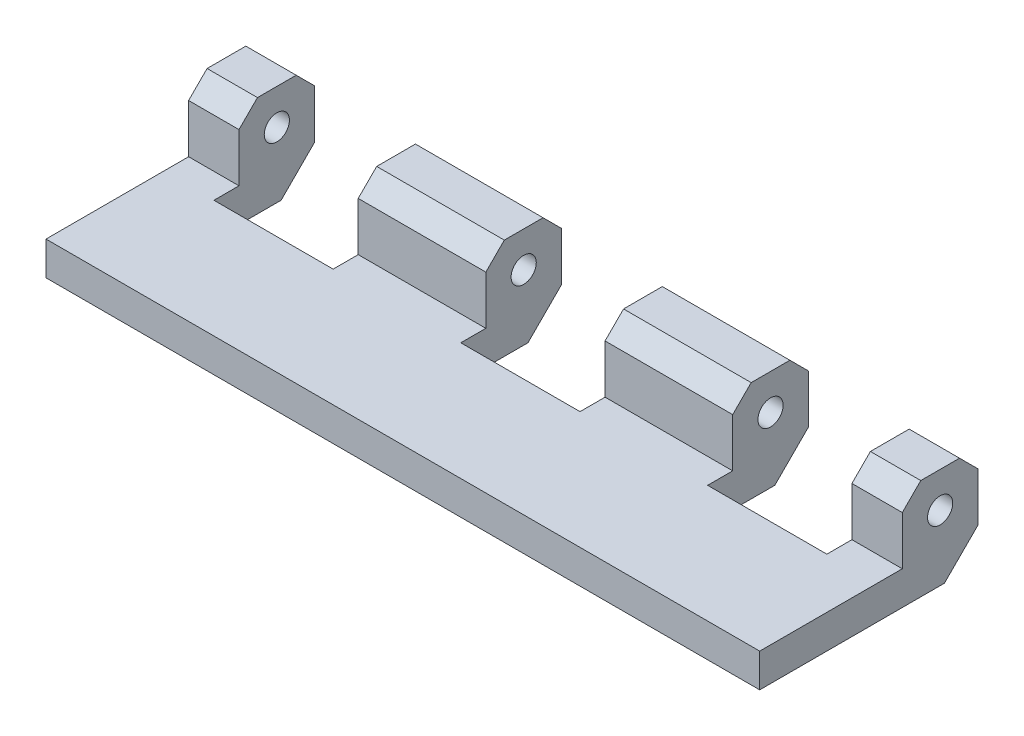
ISO-10303-21;
HEADER;
FILE_DESCRIPTION(('STEP AP214'),'2;1');
FILE_NAME('part.step','',(''),(''),'','','');
FILE_SCHEMA(('AUTOMOTIVE_DESIGN { 1 0 10303 214 1 1 1 1 }'));
ENDSEC;
DATA;
#1=APPLICATION_CONTEXT('core data for automotive mechanical design processes');
#2=APPLICATION_PROTOCOL_DEFINITION('international standard','automotive_design',2000,#1);
#3=PRODUCT_CONTEXT('',#1,'mechanical');
#4=PRODUCT('Part','Part','',(#3));
#5=PRODUCT_RELATED_PRODUCT_CATEGORY('part','',(#4));
#6=PRODUCT_DEFINITION_FORMATION('','',#4);
#7=PRODUCT_DEFINITION_CONTEXT('part definition',#1,'design');
#8=PRODUCT_DEFINITION('design','',#6,#7);
#9=PRODUCT_DEFINITION_SHAPE('','',#8);
#10=(LENGTH_UNIT() NAMED_UNIT(*) SI_UNIT(.MILLI.,.METRE.));
#11=(NAMED_UNIT(*) PLANE_ANGLE_UNIT() SI_UNIT($,.RADIAN.));
#12=(NAMED_UNIT(*) SI_UNIT($,.STERADIAN.) SOLID_ANGLE_UNIT());
#13=UNCERTAINTY_MEASURE_WITH_UNIT(LENGTH_MEASURE(1.E-05),#10,'distance_accuracy_value','');
#14=(GEOMETRIC_REPRESENTATION_CONTEXT(3) GLOBAL_UNCERTAINTY_ASSIGNED_CONTEXT((#13)) GLOBAL_UNIT_ASSIGNED_CONTEXT((#10,
#11,#12)) REPRESENTATION_CONTEXT('',''));
#15=CARTESIAN_POINT('',(0.,0.,0.));
#16=DIRECTION('',(0.,0.,1.));
#17=DIRECTION('',(1.,0.,0.));
#18=AXIS2_PLACEMENT_3D('',#15,#16,#17);
#19=CARTESIAN_POINT('',(-9.00000000000001,12.,0.));
#20=DIRECTION('',(0.,0.,1.));
#21=DIRECTION('',(1.,0.,0.));
#22=AXIS2_PLACEMENT_3D('',#19,#20,#21);
#23=PLANE('',#22);
#24=DIRECTION('',(-1.,0.,0.));
#25=VECTOR('',#24,1.);
#26=CARTESIAN_POINT('',(-9.00000000000001,4.,0.));
#27=LINE('',#26,#25);
#28=CARTESIAN_POINT('',(55.8,3.9999999999998,2.06016328849326E-13));
#29=VERTEX_POINT('',#28);
#30=CARTESIAN_POINT('',(40.6,4.,0.));
#31=VERTEX_POINT('',#30);
#32=EDGE_CURVE('E511',#29,#31,#27,.T.);
#33=ORIENTED_EDGE('',*,*,#32,.T.);
#34=DIRECTION('',(0.,1.,0.));
#35=VECTOR('',#34,1.);
#36=CARTESIAN_POINT('',(40.6,0.,0.));
#37=LINE('',#36,#35);
#38=CARTESIAN_POINT('',(40.6,9.79999999999999,0.));
#39=VERTEX_POINT('',#38);
#40=EDGE_CURVE('E284',#31,#39,#37,.T.);
#41=ORIENTED_EDGE('',*,*,#40,.T.);
#42=DIRECTION('',(1.,0.,0.));
#43=VECTOR('',#42,1.);
#44=CARTESIAN_POINT('',(76.,9.79999999999999,0.));
#45=LINE('',#44,#43);
#46=CARTESIAN_POINT('',(55.8,9.8000000000002,2.06016328849326E-13));
#47=VERTEX_POINT('',#46);
#48=EDGE_CURVE('E496',#39,#47,#45,.T.);
#49=ORIENTED_EDGE('',*,*,#48,.T.);
#50=DIRECTION('',(0.,1.,0.));
#51=VECTOR('',#50,1.);
#52=CARTESIAN_POINT('',(55.8,0.,2.06016328849326E-13));
#53=LINE('',#52,#51);
#54=EDGE_CURVE('E346',#29,#47,#53,.T.);
#55=ORIENTED_EDGE('',*,*,#54,.F.);
#56=EDGE_LOOP('',(#33,#41,#49,#55));
#57=FACE_BOUND('',#56,.T.);
#58=ADVANCED_FACE('F31',(#57),#23,.F.);
#59=CARTESIAN_POINT('',(-9.00000000000001,12.,26.));
#60=DIRECTION('',(0.,1.,0.));
#61=DIRECTION('',(0.,0.,1.));
#62=AXIS2_PLACEMENT_3D('',#59,#60,#61);
#63=PLANE('',#62);
#64=DIRECTION('',(0.,0.,-1.));
#65=VECTOR('',#64,1.);
#66=CARTESIAN_POINT('',(40.6,12.,12.0000000000004));
#67=LINE('',#66,#65);
#68=CARTESIAN_POINT('',(40.6,12.,6.81626105451301));
#69=VERTEX_POINT('',#68);
#70=CARTESIAN_POINT('',(40.6,12.,2.19999999999999));
#71=VERTEX_POINT('',#70);
#72=EDGE_CURVE('E296',#69,#71,#67,.T.);
#73=ORIENTED_EDGE('',*,*,#72,.F.);
#74=DIRECTION('',(1.,0.,0.));
#75=VECTOR('',#74,1.);
#76=CARTESIAN_POINT('',(76.,12.,6.816261054513));
#77=LINE('',#76,#75);
#78=CARTESIAN_POINT('',(55.8,12.,6.816261054513));
#79=VERTEX_POINT('',#78);
#80=EDGE_CURVE('E480',#69,#79,#77,.T.);
#81=ORIENTED_EDGE('',*,*,#80,.T.);
#82=DIRECTION('',(0.,0.,1.));
#83=VECTOR('',#82,1.);
#84=CARTESIAN_POINT('',(55.8,12.,12.0000000000002));
#85=LINE('',#84,#83);
#86=CARTESIAN_POINT('',(55.8,12.,2.19999999999999));
#87=VERTEX_POINT('',#86);
#88=EDGE_CURVE('E329',#87,#79,#85,.T.);
#89=ORIENTED_EDGE('',*,*,#88,.F.);
#90=DIRECTION('',(-1.,0.,0.));
#91=VECTOR('',#90,1.);
#92=CARTESIAN_POINT('',(-9.00000000000001,12.,2.19999999999999));
#93=LINE('',#92,#91);
#94=EDGE_CURVE('E485',#87,#71,#93,.T.);
#95=ORIENTED_EDGE('',*,*,#94,.T.);
#96=EDGE_LOOP('',(#73,#81,#89,#95));
#97=FACE_BOUND('',#96,.T.);
#98=ADVANCED_FACE('F684',(#97),#63,.T.);
#99=CARTESIAN_POINT('',(-9.00000000000001,13.0176696078048,9.01626105451301));
#100=DIRECTION('',(0.,0.,-1.));
#101=DIRECTION('',(0.,1.,0.));
#102=AXIS2_PLACEMENT_3D('',#99,#100,#101);
#103=PLANE('',#102);
#104=DIRECTION('',(-1.,0.,0.));
#105=VECTOR('',#104,1.);
#106=CARTESIAN_POINT('',(-9.00000000000001,9.80000000000001,9.01626105451301));
#107=LINE('',#106,#105);
#108=CARTESIAN_POINT('',(55.8,9.80000000000001,9.016261054513));
#109=VERTEX_POINT('',#108);
#110=CARTESIAN_POINT('',(40.6,9.80000000000001,9.016261054513));
#111=VERTEX_POINT('',#110);
#112=EDGE_CURVE('E505',#109,#111,#107,.T.);
#113=ORIENTED_EDGE('',*,*,#112,.T.);
#114=DIRECTION('',(0.,-1.,0.));
#115=VECTOR('',#114,1.);
#116=CARTESIAN_POINT('',(40.6,13.0176696078048,9.016261054513));
#117=LINE('',#116,#115);
#118=CARTESIAN_POINT('',(40.6,4.,9.01626105451299));
#119=VERTEX_POINT('',#118);
#120=EDGE_CURVE('E313',#111,#119,#117,.T.);
#121=ORIENTED_EDGE('',*,*,#120,.T.);
#122=DIRECTION('',(1.,0.,0.));
#123=VECTOR('',#122,1.);
#124=CARTESIAN_POINT('',(-9.00000000000001,4.,9.016261054513));
#125=LINE('',#124,#123);
#126=CARTESIAN_POINT('',(55.8,4.,9.01626105451299));
#127=VERTEX_POINT('',#126);
#128=EDGE_CURVE('E54',#119,#127,#125,.T.);
#129=ORIENTED_EDGE('',*,*,#128,.T.);
#130=DIRECTION('',(0.,1.,0.));
#131=VECTOR('',#130,1.);
#132=CARTESIAN_POINT('',(55.8,13.0176696078048,9.016261054513));
#133=LINE('',#132,#131);
#134=EDGE_CURVE('E342',#127,#109,#133,.T.);
#135=ORIENTED_EDGE('',*,*,#134,.T.);
#136=EDGE_LOOP('',(#113,#121,#129,#135));
#137=FACE_BOUND('',#136,.T.);
#138=ADVANCED_FACE('F689',(#137),#103,.F.);
#139=CARTESIAN_POINT('',(-9.00000000000001,12.,2.19999999999999));
#140=DIRECTION('',(0.,0.707106781186545,-0.70710678118655));
#141=DIRECTION('',(0.,0.70710678118655,0.707106781186545));
#142=AXIS2_PLACEMENT_3D('',#139,#140,#141);
#143=PLANE('',#142);
#144=DIRECTION('',(0.,-0.70710678118655,-0.707106781186545));
#145=VECTOR('',#144,1.);
#146=CARTESIAN_POINT('',(40.6,12.,2.19999999999999));
#147=LINE('',#146,#145);
#148=EDGE_CURVE('E322',#71,#39,#147,.T.);
#149=ORIENTED_EDGE('',*,*,#148,.F.);
#150=ORIENTED_EDGE('',*,*,#94,.F.);
#151=DIRECTION('',(0.,0.70710678118655,0.707106781186545));
#152=VECTOR('',#151,1.);
#153=CARTESIAN_POINT('',(55.8,12.,2.19999999999999));
#154=LINE('',#153,#152);
#155=EDGE_CURVE('E359',#47,#87,#154,.T.);
#156=ORIENTED_EDGE('',*,*,#155,.F.);
#157=ORIENTED_EDGE('',*,*,#48,.F.);
#158=EDGE_LOOP('',(#149,#150,#156,#157));
#159=FACE_BOUND('',#158,.T.);
#160=ADVANCED_FACE('F653',(#159),#143,.T.);
#161=CARTESIAN_POINT('',(-9.00000000000001,9.80000000000001,9.01626105451301));
#162=DIRECTION('',(0.,0.707106781186547,0.707106781186547));
#163=DIRECTION('',(0.,-0.707106781186548,0.707106781186548));
#164=AXIS2_PLACEMENT_3D('',#161,#162,#163);
#165=PLANE('',#164);
#166=DIRECTION('',(0.,0.707106781186548,-0.707106781186548));
#167=VECTOR('',#166,1.);
#168=CARTESIAN_POINT('',(40.6,9.8,9.016261054513));
#169=LINE('',#168,#167);
#170=EDGE_CURVE('E315',#111,#69,#169,.T.);
#171=ORIENTED_EDGE('',*,*,#170,.F.);
#172=ORIENTED_EDGE('',*,*,#112,.F.);
#173=DIRECTION('',(0.,-0.707106781186548,0.707106781186548));
#174=VECTOR('',#173,1.);
#175=CARTESIAN_POINT('',(55.8,9.8,9.016261054513));
#176=LINE('',#175,#174);
#177=EDGE_CURVE('E352',#79,#109,#176,.T.);
#178=ORIENTED_EDGE('',*,*,#177,.F.);
#179=ORIENTED_EDGE('',*,*,#80,.F.);
#180=EDGE_LOOP('',(#171,#172,#178,#179));
#181=FACE_BOUND('',#180,.T.);
#182=ADVANCED_FACE('F724',(#181),#165,.T.);
#183=CARTESIAN_POINT('',(-9.00000000000001,4.,0.));
#184=DIRECTION('',(0.,0.707106781186549,0.707106781186546));
#185=DIRECTION('',(0.,-0.707106781186546,0.707106781186549));
#186=AXIS2_PLACEMENT_3D('',#183,#184,#185);
#187=PLANE('',#186);
#188=DIRECTION('',(0.,0.707106781186546,-0.707106781186549));
#189=VECTOR('',#188,1.);
#190=CARTESIAN_POINT('',(40.6,4.,0.));
#191=LINE('',#190,#189);
#192=CARTESIAN_POINT('',(40.6,0.,4.00000000000002));
#193=VERTEX_POINT('',#192);
#194=EDGE_CURVE('E320',#31,#193,#191,.F.);
#195=ORIENTED_EDGE('',*,*,#194,.F.);
#196=ORIENTED_EDGE('',*,*,#32,.F.);
#197=DIRECTION('',(0.,-0.707106781186546,0.707106781186549));
#198=VECTOR('',#197,1.);
#199=CARTESIAN_POINT('',(55.8,4.,0.));
#200=LINE('',#199,#198);
#201=CARTESIAN_POINT('',(55.8,0.,4.00000000000002));
#202=VERTEX_POINT('',#201);
#203=EDGE_CURVE('E357',#202,#29,#200,.F.);
#204=ORIENTED_EDGE('',*,*,#203,.F.);
#205=DIRECTION('',(1.,0.,0.));
#206=VECTOR('',#205,1.);
#207=CARTESIAN_POINT('',(-9.00000000000001,0.,4.00000000000002));
#208=LINE('',#207,#206);
#209=EDGE_CURVE('E519',#193,#202,#208,.T.);
#210=ORIENTED_EDGE('',*,*,#209,.F.);
#211=EDGE_LOOP('',(#195,#196,#204,#210));
#212=FACE_BOUND('',#211,.T.);
#213=ADVANCED_FACE('F549',(#212),#187,.F.);
#214=CARTESIAN_POINT('',(-9.00000000000001,7.77705431232267,4.50813052725649));
#215=DIRECTION('',(1.,0.,0.));
#216=DIRECTION('',(0.,0.,-1.));
#217=AXIS2_PLACEMENT_3D('',#214,#215,#216);
#218=CYLINDRICAL_SURFACE('',#217,1.5);
#219=CARTESIAN_POINT('',(40.6,7.77705431232267,4.50813052725649));
#220=DIRECTION('',(1.,0.,0.));
#221=DIRECTION('',(0.,0.,-1.));
#222=AXIS2_PLACEMENT_3D('',#219,#220,#221);
#223=CIRCLE('',#222,1.5);
#224=CARTESIAN_POINT('',(40.6,7.77705431232267,3.00813052725649));
#225=VERTEX_POINT('',#224);
#226=EDGE_CURVE('E317',#225,#225,#223,.F.);
#227=ORIENTED_EDGE('',*,*,#226,.T.);
#228=EDGE_LOOP('',(#227));
#229=FACE_BOUND('',#228,.T.);
#230=CARTESIAN_POINT('',(55.8,7.77705431232267,4.50813052725649));
#231=DIRECTION('',(-1.,0.,0.));
#232=DIRECTION('',(0.,0.,1.));
#233=AXIS2_PLACEMENT_3D('',#230,#231,#232);
#234=CIRCLE('',#233,1.5);
#235=CARTESIAN_POINT('',(55.8,7.77705431232267,6.00813052725649));
#236=VERTEX_POINT('',#235);
#237=EDGE_CURVE('E354',#236,#236,#234,.F.);
#238=ORIENTED_EDGE('',*,*,#237,.T.);
#239=EDGE_LOOP('',(#238));
#240=FACE_BOUND('',#239,.T.);
#241=ADVANCED_FACE('F694',(#229,#240),#218,.F.);
#242=CARTESIAN_POINT('',(76.,4.00000000000001,0.));
#243=VERTEX_POINT('',#242);
#244=CARTESIAN_POINT('',(70.,3.9999999999998,2.06016328849326E-13));
#245=VERTEX_POINT('',#244);
#246=EDGE_CURVE('E507',#243,#245,#27,.T.);
#247=ORIENTED_EDGE('',*,*,#246,.T.);
#248=DIRECTION('',(0.,1.,0.));
#249=VECTOR('',#248,1.);
#250=CARTESIAN_POINT('',(70.,0.,2.06016328849326E-13));
#251=LINE('',#250,#249);
#252=CARTESIAN_POINT('',(70.,9.8000000000002,2.06016328849326E-13));
#253=VERTEX_POINT('',#252);
#254=EDGE_CURVE('E335',#245,#253,#251,.T.);
#255=ORIENTED_EDGE('',*,*,#254,.T.);
#256=CARTESIAN_POINT('',(76.,9.79999999999999,0.));
#257=VERTEX_POINT('',#256);
#258=EDGE_CURVE('E490',#253,#257,#45,.T.);
#259=ORIENTED_EDGE('',*,*,#258,.T.);
#260=DIRECTION('',(0.,-1.,0.));
#261=VECTOR('',#260,1.);
#262=CARTESIAN_POINT('',(76.,12.,0.));
#263=LINE('',#262,#261);
#264=EDGE_CURVE('E466',#257,#243,#263,.T.);
#265=ORIENTED_EDGE('',*,*,#264,.T.);
#266=EDGE_LOOP('',(#247,#255,#259,#265));
#267=FACE_BOUND('',#266,.T.);
#268=ADVANCED_FACE('F567',(#267),#23,.F.);
#269=DIRECTION('',(0.,0.,-1.));
#270=VECTOR('',#269,1.);
#271=CARTESIAN_POINT('',(70.,12.,12.0000000000002));
#272=LINE('',#271,#270);
#273=CARTESIAN_POINT('',(70.,12.,6.816261054513));
#274=VERTEX_POINT('',#273);
#275=CARTESIAN_POINT('',(70.,12.,2.19999999999999));
#276=VERTEX_POINT('',#275);
#277=EDGE_CURVE('E324',#274,#276,#272,.T.);
#278=ORIENTED_EDGE('',*,*,#277,.F.);
#279=CARTESIAN_POINT('',(76.,12.,6.816261054513));
#280=VERTEX_POINT('',#279);
#281=EDGE_CURVE('E474',#274,#280,#77,.T.);
#282=ORIENTED_EDGE('',*,*,#281,.T.);
#283=DIRECTION('',(0.,0.,-1.));
#284=VECTOR('',#283,1.);
#285=CARTESIAN_POINT('',(76.,12.,0.));
#286=LINE('',#285,#284);
#287=CARTESIAN_POINT('',(76.,12.,2.19999999999999));
#288=VERTEX_POINT('',#287);
#289=EDGE_CURVE('E453',#280,#288,#286,.T.);
#290=ORIENTED_EDGE('',*,*,#289,.T.);
#291=EDGE_CURVE('E481',#288,#276,#93,.T.);
#292=ORIENTED_EDGE('',*,*,#291,.T.);
#293=EDGE_LOOP('',(#278,#282,#290,#292));
#294=FACE_BOUND('',#293,.T.);
#295=ADVANCED_FACE('F577',(#294),#63,.T.);
#296=CARTESIAN_POINT('',(76.,9.80000000000001,9.01626105451299));
#297=VERTEX_POINT('',#296);
#298=CARTESIAN_POINT('',(70.,9.80000000000001,9.01626105451299));
#299=VERTEX_POINT('',#298);
#300=EDGE_CURVE('E501',#297,#299,#107,.T.);
#301=ORIENTED_EDGE('',*,*,#300,.T.);
#302=DIRECTION('',(0.,-1.,0.));
#303=VECTOR('',#302,1.);
#304=CARTESIAN_POINT('',(70.,13.0176696078048,9.01626105451299));
#305=LINE('',#304,#303);
#306=CARTESIAN_POINT('',(70.,4.,9.01626105451299));
#307=VERTEX_POINT('',#306);
#308=EDGE_CURVE('E361',#299,#307,#305,.T.);
#309=ORIENTED_EDGE('',*,*,#308,.T.);
#310=CARTESIAN_POINT('',(76.,4.,9.01626105451299));
#311=VERTEX_POINT('',#310);
#312=EDGE_CURVE('E437',#307,#311,#125,.T.);
#313=ORIENTED_EDGE('',*,*,#312,.T.);
#314=DIRECTION('',(0.,1.,0.));
#315=VECTOR('',#314,1.);
#316=CARTESIAN_POINT('',(76.,13.0176696078048,9.01626105451299));
#317=LINE('',#316,#315);
#318=EDGE_CURVE('E434',#311,#297,#317,.T.);
#319=ORIENTED_EDGE('',*,*,#318,.T.);
#320=EDGE_LOOP('',(#301,#309,#313,#319));
#321=FACE_BOUND('',#320,.T.);
#322=ADVANCED_FACE('F586',(#321),#103,.F.);
#323=DIRECTION('',(0.,-0.70710678118655,-0.707106781186545));
#324=VECTOR('',#323,1.);
#325=CARTESIAN_POINT('',(70.,12.,2.19999999999999));
#326=LINE('',#325,#324);
#327=EDGE_CURVE('E371',#276,#253,#326,.T.);
#328=ORIENTED_EDGE('',*,*,#327,.F.);
#329=ORIENTED_EDGE('',*,*,#291,.F.);
#330=DIRECTION('',(0.,0.70710678118655,0.707106781186545));
#331=VECTOR('',#330,1.);
#332=CARTESIAN_POINT('',(76.,12.,2.19999999999999));
#333=LINE('',#332,#331);
#334=EDGE_CURVE('E498',#257,#288,#333,.T.);
#335=ORIENTED_EDGE('',*,*,#334,.F.);
#336=ORIENTED_EDGE('',*,*,#258,.F.);
#337=EDGE_LOOP('',(#328,#329,#335,#336));
#338=FACE_BOUND('',#337,.T.);
#339=ADVANCED_FACE('F574',(#338),#143,.T.);
#340=DIRECTION('',(0.,0.707106781186548,-0.707106781186548));
#341=VECTOR('',#340,1.);
#342=CARTESIAN_POINT('',(70.,9.8,9.016261054513));
#343=LINE('',#342,#341);
#344=EDGE_CURVE('E364',#299,#274,#343,.T.);
#345=ORIENTED_EDGE('',*,*,#344,.F.);
#346=ORIENTED_EDGE('',*,*,#300,.F.);
#347=DIRECTION('',(0.,-0.707106781186548,0.707106781186548));
#348=VECTOR('',#347,1.);
#349=CARTESIAN_POINT('',(76.,9.8,9.016261054513));
#350=LINE('',#349,#348);
#351=EDGE_CURVE('E494',#280,#297,#350,.T.);
#352=ORIENTED_EDGE('',*,*,#351,.F.);
#353=ORIENTED_EDGE('',*,*,#281,.F.);
#354=EDGE_LOOP('',(#345,#346,#352,#353));
#355=FACE_BOUND('',#354,.T.);
#356=ADVANCED_FACE('F584',(#355),#165,.T.);
#357=DIRECTION('',(0.,0.707106781186546,-0.707106781186549));
#358=VECTOR('',#357,1.);
#359=CARTESIAN_POINT('',(70.,4.,0.));
#360=LINE('',#359,#358);
#361=CARTESIAN_POINT('',(70.,0.,4.00000000000002));
#362=VERTEX_POINT('',#361);
#363=EDGE_CURVE('E369',#245,#362,#360,.F.);
#364=ORIENTED_EDGE('',*,*,#363,.F.);
#365=ORIENTED_EDGE('',*,*,#246,.F.);
#366=DIRECTION('',(0.,-0.707106781186546,0.707106781186549));
#367=VECTOR('',#366,1.);
#368=CARTESIAN_POINT('',(76.,4.,0.));
#369=LINE('',#368,#367);
#370=CARTESIAN_POINT('',(76.,0.,4.00000000000002));
#371=VERTEX_POINT('',#370);
#372=EDGE_CURVE('E518',#371,#243,#369,.F.);
#373=ORIENTED_EDGE('',*,*,#372,.F.);
#374=EDGE_CURVE('E514',#362,#371,#208,.T.);
#375=ORIENTED_EDGE('',*,*,#374,.F.);
#376=EDGE_LOOP('',(#364,#365,#373,#375));
#377=FACE_BOUND('',#376,.T.);
#378=ADVANCED_FACE('F565',(#377),#187,.F.);
#379=CARTESIAN_POINT('',(70.,7.77705431232267,4.50813052725649));
#380=DIRECTION('',(1.,0.,0.));
#381=DIRECTION('',(0.,0.,-1.));
#382=AXIS2_PLACEMENT_3D('',#379,#380,#381);
#383=CIRCLE('',#382,1.5);
#384=CARTESIAN_POINT('',(70.,7.77705431232267,3.00813052725649));
#385=VERTEX_POINT('',#384);
#386=EDGE_CURVE('E366',#385,#385,#383,.F.);
#387=ORIENTED_EDGE('',*,*,#386,.T.);
#388=EDGE_LOOP('',(#387));
#389=FACE_BOUND('',#388,.T.);
#390=CARTESIAN_POINT('',(76.,7.77705431232267,4.50813052725649));
#391=DIRECTION('',(1.,0.,0.));
#392=DIRECTION('',(0.,0.,-1.));
#393=AXIS2_PLACEMENT_3D('',#390,#391,#392);
#394=CIRCLE('',#393,1.5);
#395=CARTESIAN_POINT('',(76.,7.77705431232267,3.00813052725649));
#396=VERTEX_POINT('',#395);
#397=EDGE_CURVE('E423',#396,#396,#394,.T.);
#398=ORIENTED_EDGE('',*,*,#397,.T.);
#399=EDGE_LOOP('',(#398));
#400=FACE_BOUND('',#399,.T.);
#401=ADVANCED_FACE('F702',(#389,#400),#218,.F.);
#402=CARTESIAN_POINT('',(11.2,9.8000000000002,2.06016328849326E-13));
#403=VERTEX_POINT('',#402);
#404=CARTESIAN_POINT('',(26.4,9.79999999999999,0.));
#405=VERTEX_POINT('',#404);
#406=EDGE_CURVE('E495',#403,#405,#45,.T.);
#407=ORIENTED_EDGE('',*,*,#406,.T.);
#408=DIRECTION('',(0.,1.,0.));
#409=VECTOR('',#408,1.);
#410=CARTESIAN_POINT('',(26.4,0.,0.));
#411=LINE('',#410,#409);
#412=CARTESIAN_POINT('',(26.4,4.,0.));
#413=VERTEX_POINT('',#412);
#414=EDGE_CURVE('E275',#413,#405,#411,.T.);
#415=ORIENTED_EDGE('',*,*,#414,.F.);
#416=CARTESIAN_POINT('',(11.2,3.9999999999998,2.06016328849326E-13));
#417=VERTEX_POINT('',#416);
#418=EDGE_CURVE('E512',#413,#417,#27,.T.);
#419=ORIENTED_EDGE('',*,*,#418,.T.);
#420=DIRECTION('',(0.,1.,0.));
#421=VECTOR('',#420,1.);
#422=CARTESIAN_POINT('',(11.2,0.,2.06016328849326E-13));
#423=LINE('',#422,#421);
#424=EDGE_CURVE('E383',#417,#403,#423,.T.);
#425=ORIENTED_EDGE('',*,*,#424,.T.);
#426=EDGE_LOOP('',(#407,#415,#419,#425));
#427=FACE_BOUND('',#426,.T.);
#428=ADVANCED_FACE('F637',(#427),#23,.F.);
#429=DIRECTION('',(0.,0.,1.));
#430=VECTOR('',#429,1.);
#431=CARTESIAN_POINT('',(26.4,12.,12.0000000000004));
#432=LINE('',#431,#430);
#433=CARTESIAN_POINT('',(26.4,12.,2.19999999999999));
#434=VERTEX_POINT('',#433);
#435=CARTESIAN_POINT('',(26.4,12.,6.81626105451301));
#436=VERTEX_POINT('',#435);
#437=EDGE_CURVE('E293',#434,#436,#432,.T.);
#438=ORIENTED_EDGE('',*,*,#437,.F.);
#439=CARTESIAN_POINT('',(11.2,12.,2.19999999999999));
#440=VERTEX_POINT('',#439);
#441=EDGE_CURVE('E486',#434,#440,#93,.T.);
#442=ORIENTED_EDGE('',*,*,#441,.T.);
#443=DIRECTION('',(0.,0.,-1.));
#444=VECTOR('',#443,1.);
#445=CARTESIAN_POINT('',(11.2,12.,12.0000000000002));
#446=LINE('',#445,#444);
#447=CARTESIAN_POINT('',(11.2,12.,6.81626105451301));
#448=VERTEX_POINT('',#447);
#449=EDGE_CURVE('E373',#448,#440,#446,.T.);
#450=ORIENTED_EDGE('',*,*,#449,.F.);
#451=EDGE_CURVE('E479',#448,#436,#77,.T.);
#452=ORIENTED_EDGE('',*,*,#451,.T.);
#453=EDGE_LOOP('',(#438,#442,#450,#452));
#454=FACE_BOUND('',#453,.T.);
#455=ADVANCED_FACE('F661',(#454),#63,.T.);
#456=CARTESIAN_POINT('',(11.2,4.,9.016261054513));
#457=VERTEX_POINT('',#456);
#458=CARTESIAN_POINT('',(26.4,4.,9.016261054513));
#459=VERTEX_POINT('',#458);
#460=EDGE_CURVE('E446',#457,#459,#125,.T.);
#461=ORIENTED_EDGE('',*,*,#460,.T.);
#462=DIRECTION('',(0.,1.,0.));
#463=VECTOR('',#462,1.);
#464=CARTESIAN_POINT('',(26.4,13.0176696078048,9.016261054513));
#465=LINE('',#464,#463);
#466=CARTESIAN_POINT('',(26.4,9.80000000000001,9.016261054513));
#467=VERTEX_POINT('',#466);
#468=EDGE_CURVE('E46',#459,#467,#465,.T.);
#469=ORIENTED_EDGE('',*,*,#468,.T.);
#470=CARTESIAN_POINT('',(11.2,9.80000000000001,9.016261054513));
#471=VERTEX_POINT('',#470);
#472=EDGE_CURVE('E506',#467,#471,#107,.T.);
#473=ORIENTED_EDGE('',*,*,#472,.T.);
#474=DIRECTION('',(0.,-1.,0.));
#475=VECTOR('',#474,1.);
#476=CARTESIAN_POINT('',(11.2,13.0176696078048,9.016261054513));
#477=LINE('',#476,#475);
#478=EDGE_CURVE('E415',#471,#457,#477,.T.);
#479=ORIENTED_EDGE('',*,*,#478,.T.);
#480=EDGE_LOOP('',(#461,#469,#473,#479));
#481=FACE_BOUND('',#480,.T.);
#482=ADVANCED_FACE('F671',(#481),#103,.F.);
#483=DIRECTION('',(0.,0.70710678118655,0.707106781186545));
#484=VECTOR('',#483,1.);
#485=CARTESIAN_POINT('',(26.4,12.,2.19999999999999));
#486=LINE('',#485,#484);
#487=EDGE_CURVE('E311',#405,#434,#486,.T.);
#488=ORIENTED_EDGE('',*,*,#487,.F.);
#489=ORIENTED_EDGE('',*,*,#406,.F.);
#490=DIRECTION('',(0.,-0.70710678118655,-0.707106781186545));
#491=VECTOR('',#490,1.);
#492=CARTESIAN_POINT('',(11.2,12.,2.19999999999999));
#493=LINE('',#492,#491);
#494=EDGE_CURVE('E421',#440,#403,#493,.T.);
#495=ORIENTED_EDGE('',*,*,#494,.F.);
#496=ORIENTED_EDGE('',*,*,#441,.F.);
#497=EDGE_LOOP('',(#488,#489,#495,#496));
#498=FACE_BOUND('',#497,.T.);
#499=ADVANCED_FACE('F668',(#498),#143,.T.);
#500=DIRECTION('',(0.,-0.707106781186548,0.707106781186548));
#501=VECTOR('',#500,1.);
#502=CARTESIAN_POINT('',(26.4,9.8,9.016261054513));
#503=LINE('',#502,#501);
#504=EDGE_CURVE('E304',#436,#467,#503,.T.);
#505=ORIENTED_EDGE('',*,*,#504,.F.);
#506=ORIENTED_EDGE('',*,*,#451,.F.);
#507=DIRECTION('',(0.,0.707106781186548,-0.707106781186548));
#508=VECTOR('',#507,1.);
#509=CARTESIAN_POINT('',(11.2,9.8,9.016261054513));
#510=LINE('',#509,#508);
#511=EDGE_CURVE('E413',#471,#448,#510,.T.);
#512=ORIENTED_EDGE('',*,*,#511,.F.);
#513=ORIENTED_EDGE('',*,*,#472,.F.);
#514=EDGE_LOOP('',(#505,#506,#512,#513));
#515=FACE_BOUND('',#514,.T.);
#516=ADVANCED_FACE('F670',(#515),#165,.T.);
#517=DIRECTION('',(0.,-0.707106781186546,0.707106781186549));
#518=VECTOR('',#517,1.);
#519=CARTESIAN_POINT('',(26.4,4.,0.));
#520=LINE('',#519,#518);
#521=CARTESIAN_POINT('',(26.4,0.,4.00000000000002));
#522=VERTEX_POINT('',#521);
#523=EDGE_CURVE('E309',#522,#413,#520,.F.);
#524=ORIENTED_EDGE('',*,*,#523,.F.);
#525=CARTESIAN_POINT('',(11.2,0.,4.00000000000002));
#526=VERTEX_POINT('',#525);
#527=EDGE_CURVE('E290',#526,#522,#208,.T.);
#528=ORIENTED_EDGE('',*,*,#527,.F.);
#529=DIRECTION('',(0.,0.707106781186546,-0.707106781186549));
#530=VECTOR('',#529,1.);
#531=CARTESIAN_POINT('',(11.2,4.,0.));
#532=LINE('',#531,#530);
#533=EDGE_CURVE('E411',#417,#526,#532,.F.);
#534=ORIENTED_EDGE('',*,*,#533,.F.);
#535=ORIENTED_EDGE('',*,*,#418,.F.);
#536=EDGE_LOOP('',(#524,#528,#534,#535));
#537=FACE_BOUND('',#536,.T.);
#538=ADVANCED_FACE('F631',(#537),#187,.F.);
#539=CARTESIAN_POINT('',(26.4,7.77705431232267,4.50813052725649));
#540=DIRECTION('',(-1.,0.,0.));
#541=DIRECTION('',(0.,0.,1.));
#542=AXIS2_PLACEMENT_3D('',#539,#540,#541);
#543=CIRCLE('',#542,1.5);
#544=CARTESIAN_POINT('',(26.4,7.77705431232267,6.00813052725649));
#545=VERTEX_POINT('',#544);
#546=EDGE_CURVE('E306',#545,#545,#543,.F.);
#547=ORIENTED_EDGE('',*,*,#546,.T.);
#548=EDGE_LOOP('',(#547));
#549=FACE_BOUND('',#548,.T.);
#550=CARTESIAN_POINT('',(11.2,7.77705431232267,4.50813052725649));
#551=DIRECTION('',(1.,0.,0.));
#552=DIRECTION('',(0.,0.,-1.));
#553=AXIS2_PLACEMENT_3D('',#550,#551,#552);
#554=CIRCLE('',#553,1.5);
#555=CARTESIAN_POINT('',(11.2,7.77705431232267,3.00813052725649));
#556=VERTEX_POINT('',#555);
#557=EDGE_CURVE('E410',#556,#556,#554,.F.);
#558=ORIENTED_EDGE('',*,*,#557,.T.);
#559=EDGE_LOOP('',(#558));
#560=FACE_BOUND('',#559,.T.);
#561=ADVANCED_FACE('F709',(#549,#560),#218,.F.);
#562=CARTESIAN_POINT('',(-9.00000000000001,12.,0.));
#563=DIRECTION('',(1.,0.,0.));
#564=DIRECTION('',(0.,0.,-1.));
#565=AXIS2_PLACEMENT_3D('',#562,#563,#564);
#566=PLANE('',#565);
#567=CARTESIAN_POINT('',(-9.00000000000001,7.77705431232267,4.50813052725649));
#568=DIRECTION('',(1.,0.,0.));
#569=DIRECTION('',(0.,0.,-1.));
#570=AXIS2_PLACEMENT_3D('',#567,#568,#569);
#571=CIRCLE('',#570,1.5);
#572=CARTESIAN_POINT('',(-9.00000000000001,7.77705431232267,3.00813052725649));
#573=VERTEX_POINT('',#572);
#574=EDGE_CURVE('E424',#573,#573,#571,.T.);
#575=ORIENTED_EDGE('',*,*,#574,.T.);
#576=EDGE_LOOP('',(#575));
#577=FACE_BOUND('',#576,.T.);
#578=DIRECTION('',(0.,-1.,0.));
#579=VECTOR('',#578,1.);
#580=CARTESIAN_POINT('',(-9.00000000000001,12.,0.));
#581=LINE('',#580,#579);
#582=CARTESIAN_POINT('',(-9.00000000000001,9.79999999999999,0.));
#583=VERTEX_POINT('',#582);
#584=CARTESIAN_POINT('',(-9.00000000000001,4.00000000000001,0.));
#585=VERTEX_POINT('',#584);
#586=EDGE_CURVE('E457',#583,#585,#581,.T.);
#587=ORIENTED_EDGE('',*,*,#586,.T.);
#588=DIRECTION('',(0.,0.707106781186546,-0.707106781186549));
#589=VECTOR('',#588,1.);
#590=CARTESIAN_POINT('',(-9.00000000000001,4.,0.));
#591=LINE('',#590,#589);
#592=CARTESIAN_POINT('',(-9.00000000000001,0.,4.00000000000002));
#593=VERTEX_POINT('',#592);
#594=EDGE_CURVE('E510',#585,#593,#591,.F.);
#595=ORIENTED_EDGE('',*,*,#594,.T.);
#596=DIRECTION('',(0.,0.,1.));
#597=VECTOR('',#596,1.);
#598=CARTESIAN_POINT('',(-9.00000000000001,0.,0.));
#599=LINE('',#598,#597);
#600=CARTESIAN_POINT('',(-9.00000000000001,0.,26.));
#601=VERTEX_POINT('',#600);
#602=EDGE_CURVE('E449',#593,#601,#599,.T.);
#603=ORIENTED_EDGE('',*,*,#602,.T.);
#604=DIRECTION('',(0.,-1.,0.));
#605=VECTOR('',#604,1.);
#606=CARTESIAN_POINT('',(-9.00000000000001,12.,26.));
#607=LINE('',#606,#605);
#608=CARTESIAN_POINT('',(-9.00000000000001,4.,26.));
#609=VERTEX_POINT('',#608);
#610=EDGE_CURVE('E471',#609,#601,#607,.T.);
#611=ORIENTED_EDGE('',*,*,#610,.F.);
#612=DIRECTION('',(0.,0.,-1.));
#613=VECTOR('',#612,1.);
#614=CARTESIAN_POINT('',(-9.00000000000001,4.,28.1229653541004));
#615=LINE('',#614,#613);
#616=CARTESIAN_POINT('',(-9.00000000000001,4.,9.016261054513));
#617=VERTEX_POINT('',#616);
#618=EDGE_CURVE('E430',#609,#617,#615,.T.);
#619=ORIENTED_EDGE('',*,*,#618,.T.);
#620=DIRECTION('',(0.,1.,0.));
#621=VECTOR('',#620,1.);
#622=CARTESIAN_POINT('',(-9.00000000000001,13.0176696078048,9.01626105451301));
#623=LINE('',#622,#621);
#624=CARTESIAN_POINT('',(-9.00000000000001,9.80000000000001,9.01626105451301));
#625=VERTEX_POINT('',#624);
#626=EDGE_CURVE('E433',#617,#625,#623,.T.);
#627=ORIENTED_EDGE('',*,*,#626,.T.);
#628=DIRECTION('',(0.,0.707106781186548,-0.707106781186548));
#629=VECTOR('',#628,1.);
#630=CARTESIAN_POINT('',(-9.00000000000001,9.80000000000001,9.01626105451301));
#631=LINE('',#630,#629);
#632=CARTESIAN_POINT('',(-9.00000000000001,12.,6.81626105451301));
#633=VERTEX_POINT('',#632);
#634=EDGE_CURVE('E484',#625,#633,#631,.T.);
#635=ORIENTED_EDGE('',*,*,#634,.T.);
#636=DIRECTION('',(0.,0.,1.));
#637=VECTOR('',#636,1.);
#638=CARTESIAN_POINT('',(-9.00000000000001,12.,0.));
#639=LINE('',#638,#637);
#640=CARTESIAN_POINT('',(-9.00000000000001,12.,2.19999999999999));
#641=VERTEX_POINT('',#640);
#642=EDGE_CURVE('E450',#641,#633,#639,.T.);
#643=ORIENTED_EDGE('',*,*,#642,.F.);
#644=DIRECTION('',(0.,-0.70710678118655,-0.707106781186545));
#645=VECTOR('',#644,1.);
#646=CARTESIAN_POINT('',(-9.00000000000001,12.,2.19999999999999));
#647=LINE('',#646,#645);
#648=EDGE_CURVE('E488',#641,#583,#647,.T.);
#649=ORIENTED_EDGE('',*,*,#648,.T.);
#650=EDGE_LOOP('',(#587,#595,#603,#611,#619,#627,#635,#643,#649));
#651=FACE_BOUND('',#650,.T.);
#652=ADVANCED_FACE('F717',(#577,#651),#566,.F.);
#653=CARTESIAN_POINT('',(-9.00000000000001,12.,26.));
#654=DIRECTION('',(0.,0.,-1.));
#655=DIRECTION('',(-1.,0.,0.));
#656=AXIS2_PLACEMENT_3D('',#653,#654,#655);
#657=PLANE('',#656);
#658=DIRECTION('',(0.,-1.,0.));
#659=VECTOR('',#658,1.);
#660=CARTESIAN_POINT('',(76.,12.,26.));
#661=LINE('',#660,#659);
#662=CARTESIAN_POINT('',(76.,4.,26.));
#663=VERTEX_POINT('',#662);
#664=CARTESIAN_POINT('',(76.,0.,26.));
#665=VERTEX_POINT('',#664);
#666=EDGE_CURVE('E469',#663,#665,#661,.T.);
#667=ORIENTED_EDGE('',*,*,#666,.F.);
#668=DIRECTION('',(-1.,0.,0.));
#669=VECTOR('',#668,1.);
#670=CARTESIAN_POINT('',(-9.00000000000001,4.,26.));
#671=LINE('',#670,#669);
#672=EDGE_CURVE('E445',#663,#609,#671,.T.);
#673=ORIENTED_EDGE('',*,*,#672,.T.);
#674=ORIENTED_EDGE('',*,*,#610,.T.);
#675=DIRECTION('',(1.,0.,0.));
#676=VECTOR('',#675,1.);
#677=CARTESIAN_POINT('',(-9.00000000000001,0.,26.));
#678=LINE('',#677,#676);
#679=EDGE_CURVE('E459',#601,#665,#678,.T.);
#680=ORIENTED_EDGE('',*,*,#679,.T.);
#681=EDGE_LOOP('',(#667,#673,#674,#680));
#682=FACE_BOUND('',#681,.T.);
#683=ADVANCED_FACE('F589',(#682),#657,.F.);
#684=CARTESIAN_POINT('',(76.,12.,0.));
#685=DIRECTION('',(-1.,0.,0.));
#686=DIRECTION('',(0.,0.,1.));
#687=AXIS2_PLACEMENT_3D('',#684,#685,#686);
#688=PLANE('',#687);
#689=ORIENTED_EDGE('',*,*,#397,.F.);
#690=EDGE_LOOP('',(#689));
#691=FACE_BOUND('',#690,.T.);
#692=DIRECTION('',(0.,0.,-1.));
#693=VECTOR('',#692,1.);
#694=CARTESIAN_POINT('',(76.,0.,0.));
#695=LINE('',#694,#693);
#696=EDGE_CURVE('E454',#665,#371,#695,.T.);
#697=ORIENTED_EDGE('',*,*,#696,.T.);
#698=ORIENTED_EDGE('',*,*,#372,.T.);
#699=ORIENTED_EDGE('',*,*,#264,.F.);
#700=ORIENTED_EDGE('',*,*,#334,.T.);
#701=ORIENTED_EDGE('',*,*,#289,.F.);
#702=ORIENTED_EDGE('',*,*,#351,.T.);
#703=ORIENTED_EDGE('',*,*,#318,.F.);
#704=DIRECTION('',(0.,0.,-1.));
#705=VECTOR('',#704,1.);
#706=CARTESIAN_POINT('',(76.,4.,28.1229653541004));
#707=LINE('',#706,#705);
#708=EDGE_CURVE('E427',#663,#311,#707,.T.);
#709=ORIENTED_EDGE('',*,*,#708,.F.);
#710=ORIENTED_EDGE('',*,*,#666,.T.);
#711=EDGE_LOOP('',(#697,#698,#699,#700,#701,#702,#703,#709,#710));
#712=FACE_BOUND('',#711,.T.);
#713=ADVANCED_FACE('F560',(#691,#712),#688,.F.);
#714=CARTESIAN_POINT('',(-3.,9.8000000000002,2.06016328849326E-13));
#715=VERTEX_POINT('',#714);
#716=EDGE_CURVE('E491',#583,#715,#45,.T.);
#717=ORIENTED_EDGE('',*,*,#716,.T.);
#718=DIRECTION('',(0.,1.,0.));
#719=VECTOR('',#718,1.);
#720=CARTESIAN_POINT('',(-3.,0.,2.06016328849326E-13));
#721=LINE('',#720,#719);
#722=CARTESIAN_POINT('',(-3.,3.9999999999998,2.06016328849326E-13));
#723=VERTEX_POINT('',#722);
#724=EDGE_CURVE('E394',#723,#715,#721,.T.);
#725=ORIENTED_EDGE('',*,*,#724,.F.);
#726=EDGE_CURVE('E504',#723,#585,#27,.T.);
#727=ORIENTED_EDGE('',*,*,#726,.T.);
#728=ORIENTED_EDGE('',*,*,#586,.F.);
#729=EDGE_LOOP('',(#717,#725,#727,#728));
#730=FACE_BOUND('',#729,.T.);
#731=ADVANCED_FACE('F604',(#730),#23,.F.);
#732=DIRECTION('',(0.,0.,1.));
#733=VECTOR('',#732,1.);
#734=CARTESIAN_POINT('',(-3.,12.,12.0000000000002));
#735=LINE('',#734,#733);
#736=CARTESIAN_POINT('',(-3.,12.,2.19999999999999));
#737=VERTEX_POINT('',#736);
#738=CARTESIAN_POINT('',(-3.,12.,6.81626105451301));
#739=VERTEX_POINT('',#738);
#740=EDGE_CURVE('E377',#737,#739,#735,.T.);
#741=ORIENTED_EDGE('',*,*,#740,.F.);
#742=EDGE_CURVE('E478',#737,#641,#93,.T.);
#743=ORIENTED_EDGE('',*,*,#742,.T.);
#744=ORIENTED_EDGE('',*,*,#642,.T.);
#745=EDGE_CURVE('E475',#633,#739,#77,.T.);
#746=ORIENTED_EDGE('',*,*,#745,.T.);
#747=EDGE_LOOP('',(#741,#743,#744,#746));
#748=FACE_BOUND('',#747,.T.);
#749=ADVANCED_FACE('F615',(#748),#63,.T.);
#750=CARTESIAN_POINT('',(-9.00000000000001,0.,26.));
#751=DIRECTION('',(0.,1.,0.));
#752=DIRECTION('',(0.,0.,1.));
#753=AXIS2_PLACEMENT_3D('',#750,#751,#752);
#754=PLANE('',#753);
#755=DIRECTION('',(1.,0.,0.));
#756=VECTOR('',#755,1.);
#757=CARTESIAN_POINT('',(26.4,0.,12.0000000000004));
#758=LINE('',#757,#756);
#759=CARTESIAN_POINT('',(26.4,0.,12.0000000000004));
#760=VERTEX_POINT('',#759);
#761=CARTESIAN_POINT('',(40.6,0.,12.0000000000004));
#762=VERTEX_POINT('',#761);
#763=EDGE_CURVE('E278',#760,#762,#758,.T.);
#764=ORIENTED_EDGE('',*,*,#763,.T.);
#765=DIRECTION('',(0.,0.,-1.));
#766=VECTOR('',#765,1.);
#767=CARTESIAN_POINT('',(40.6,0.,12.0000000000004));
#768=LINE('',#767,#766);
#769=EDGE_CURVE('E291',#762,#193,#768,.T.);
#770=ORIENTED_EDGE('',*,*,#769,.T.);
#771=ORIENTED_EDGE('',*,*,#209,.T.);
#772=DIRECTION('',(0.,0.,1.));
#773=VECTOR('',#772,1.);
#774=CARTESIAN_POINT('',(55.8,0.,12.0000000000002));
#775=LINE('',#774,#773);
#776=CARTESIAN_POINT('',(55.8,0.,12.0000000000002));
#777=VERTEX_POINT('',#776);
#778=EDGE_CURVE('E328',#202,#777,#775,.T.);
#779=ORIENTED_EDGE('',*,*,#778,.T.);
#780=DIRECTION('',(1.,0.,0.));
#781=VECTOR('',#780,1.);
#782=CARTESIAN_POINT('',(55.8,0.,12.0000000000002));
#783=LINE('',#782,#781);
#784=CARTESIAN_POINT('',(70.,0.,12.0000000000002));
#785=VERTEX_POINT('',#784);
#786=EDGE_CURVE('E332',#777,#785,#783,.T.);
#787=ORIENTED_EDGE('',*,*,#786,.T.);
#788=DIRECTION('',(0.,0.,-1.));
#789=VECTOR('',#788,1.);
#790=CARTESIAN_POINT('',(70.,0.,12.0000000000002));
#791=LINE('',#790,#789);
#792=EDGE_CURVE('E325',#785,#362,#791,.T.);
#793=ORIENTED_EDGE('',*,*,#792,.T.);
#794=ORIENTED_EDGE('',*,*,#374,.T.);
#795=ORIENTED_EDGE('',*,*,#696,.F.);
#796=ORIENTED_EDGE('',*,*,#679,.F.);
#797=ORIENTED_EDGE('',*,*,#602,.F.);
#798=CARTESIAN_POINT('',(-3.,0.,4.00000000000002));
#799=VERTEX_POINT('',#798);
#800=EDGE_CURVE('E515',#593,#799,#208,.T.);
#801=ORIENTED_EDGE('',*,*,#800,.T.);
#802=DIRECTION('',(0.,0.,1.));
#803=VECTOR('',#802,1.);
#804=CARTESIAN_POINT('',(-3.,0.,12.0000000000002));
#805=LINE('',#804,#803);
#806=CARTESIAN_POINT('',(-3.,0.,12.0000000000002));
#807=VERTEX_POINT('',#806);
#808=EDGE_CURVE('E376',#799,#807,#805,.T.);
#809=ORIENTED_EDGE('',*,*,#808,.T.);
#810=DIRECTION('',(1.,0.,0.));
#811=VECTOR('',#810,1.);
#812=CARTESIAN_POINT('',(11.2,0.,12.0000000000002));
#813=LINE('',#812,#811);
#814=CARTESIAN_POINT('',(11.2,0.,12.0000000000002));
#815=VERTEX_POINT('',#814);
#816=EDGE_CURVE('E380',#807,#815,#813,.T.);
#817=ORIENTED_EDGE('',*,*,#816,.T.);
#818=DIRECTION('',(0.,0.,-1.));
#819=VECTOR('',#818,1.);
#820=CARTESIAN_POINT('',(11.2,0.,12.0000000000002));
#821=LINE('',#820,#819);
#822=EDGE_CURVE('E374',#815,#526,#821,.T.);
#823=ORIENTED_EDGE('',*,*,#822,.T.);
#824=ORIENTED_EDGE('',*,*,#527,.T.);
#825=DIRECTION('',(0.,0.,1.));
#826=VECTOR('',#825,1.);
#827=CARTESIAN_POINT('',(26.4,0.,12.0000000000004));
#828=LINE('',#827,#826);
#829=EDGE_CURVE('E269',#522,#760,#828,.T.);
#830=ORIENTED_EDGE('',*,*,#829,.T.);
#831=EDGE_LOOP('',(#764,#770,#771,#779,#787,#793,#794,#795,#796,#797,#801,#809,#817,#823,#824,#830));
#832=FACE_BOUND('',#831,.T.);
#833=ADVANCED_FACE('F287',(#832),#754,.F.);
#834=CARTESIAN_POINT('',(-9.00000000000001,4.,28.1229653541004));
#835=DIRECTION('',(0.,-1.,0.));
#836=DIRECTION('',(0.,0.,-1.));
#837=AXIS2_PLACEMENT_3D('',#834,#835,#836);
#838=PLANE('',#837);
#839=ORIENTED_EDGE('',*,*,#128,.F.);
#840=DIRECTION('',(0.,0.,1.));
#841=VECTOR('',#840,1.);
#842=CARTESIAN_POINT('',(40.6,4.,28.1229653541004));
#843=LINE('',#842,#841);
#844=CARTESIAN_POINT('',(40.6,4.,12.0000000000004));
#845=VERTEX_POINT('',#844);
#846=EDGE_CURVE('E11',#119,#845,#843,.T.);
#847=ORIENTED_EDGE('',*,*,#846,.T.);
#848=DIRECTION('',(-1.,0.,0.));
#849=VECTOR('',#848,1.);
#850=CARTESIAN_POINT('',(-9.00000000000001,4.,12.0000000000004));
#851=LINE('',#850,#849);
#852=CARTESIAN_POINT('',(26.4,4.,12.0000000000004));
#853=VERTEX_POINT('',#852);
#854=EDGE_CURVE('E39',#845,#853,#851,.T.);
#855=ORIENTED_EDGE('',*,*,#854,.T.);
#856=DIRECTION('',(0.,0.,-1.));
#857=VECTOR('',#856,1.);
#858=CARTESIAN_POINT('',(26.4,4.,28.1229653541004));
#859=LINE('',#858,#857);
#860=EDGE_CURVE('E271',#853,#459,#859,.T.);
#861=ORIENTED_EDGE('',*,*,#860,.T.);
#862=ORIENTED_EDGE('',*,*,#460,.F.);
#863=DIRECTION('',(0.,0.,1.));
#864=VECTOR('',#863,1.);
#865=CARTESIAN_POINT('',(11.2,4.,28.1229653541004));
#866=LINE('',#865,#864);
#867=CARTESIAN_POINT('',(11.2,4.,12.0000000000002));
#868=VERTEX_POINT('',#867);
#869=EDGE_CURVE('E418',#457,#868,#866,.T.);
#870=ORIENTED_EDGE('',*,*,#869,.T.);
#871=DIRECTION('',(-1.,0.,0.));
#872=VECTOR('',#871,1.);
#873=CARTESIAN_POINT('',(-9.00000000000001,4.,12.0000000000002));
#874=LINE('',#873,#872);
#875=CARTESIAN_POINT('',(-3.,4.,12.0000000000002));
#876=VERTEX_POINT('',#875);
#877=EDGE_CURVE('E521',#868,#876,#874,.T.);
#878=ORIENTED_EDGE('',*,*,#877,.T.);
#879=DIRECTION('',(0.,0.,-1.));
#880=VECTOR('',#879,1.);
#881=CARTESIAN_POINT('',(-3.,4.,28.1229653541004));
#882=LINE('',#881,#880);
#883=CARTESIAN_POINT('',(-3.,4.,9.016261054513));
#884=VERTEX_POINT('',#883);
#885=EDGE_CURVE('E405',#876,#884,#882,.T.);
#886=ORIENTED_EDGE('',*,*,#885,.T.);
#887=EDGE_CURVE('E442',#617,#884,#125,.T.);
#888=ORIENTED_EDGE('',*,*,#887,.F.);
#889=ORIENTED_EDGE('',*,*,#618,.F.);
#890=ORIENTED_EDGE('',*,*,#672,.F.);
#891=ORIENTED_EDGE('',*,*,#708,.T.);
#892=ORIENTED_EDGE('',*,*,#312,.F.);
#893=DIRECTION('',(0.,0.,1.));
#894=VECTOR('',#893,1.);
#895=CARTESIAN_POINT('',(70.,4.,28.1229653541004));
#896=LINE('',#895,#894);
#897=CARTESIAN_POINT('',(70.,4.,12.0000000000002));
#898=VERTEX_POINT('',#897);
#899=EDGE_CURVE('E534',#307,#898,#896,.T.);
#900=ORIENTED_EDGE('',*,*,#899,.T.);
#901=DIRECTION('',(-1.,0.,0.));
#902=VECTOR('',#901,1.);
#903=CARTESIAN_POINT('',(-9.00000000000001,4.,12.0000000000002));
#904=LINE('',#903,#902);
#905=CARTESIAN_POINT('',(55.8,4.,12.0000000000002));
#906=VERTEX_POINT('',#905);
#907=EDGE_CURVE('E531',#898,#906,#904,.T.);
#908=ORIENTED_EDGE('',*,*,#907,.T.);
#909=DIRECTION('',(0.,0.,-1.));
#910=VECTOR('',#909,1.);
#911=CARTESIAN_POINT('',(55.8,4.,28.1229653541004));
#912=LINE('',#911,#910);
#913=EDGE_CURVE('E528',#906,#127,#912,.T.);
#914=ORIENTED_EDGE('',*,*,#913,.T.);
#915=EDGE_LOOP('',(#839,#847,#855,#861,#862,#870,#878,#886,#888,#889,#890,#891,#892,#900,#908,#914));
#916=FACE_BOUND('',#915,.T.);
#917=ADVANCED_FACE('F538',(#916),#838,.F.);
#918=ORIENTED_EDGE('',*,*,#887,.T.);
#919=DIRECTION('',(0.,1.,0.));
#920=VECTOR('',#919,1.);
#921=CARTESIAN_POINT('',(-3.,13.0176696078048,9.016261054513));
#922=LINE('',#921,#920);
#923=CARTESIAN_POINT('',(-3.,9.80000000000001,9.01626105451301));
#924=VERTEX_POINT('',#923);
#925=EDGE_CURVE('E402',#884,#924,#922,.T.);
#926=ORIENTED_EDGE('',*,*,#925,.T.);
#927=EDGE_CURVE('E500',#924,#625,#107,.T.);
#928=ORIENTED_EDGE('',*,*,#927,.T.);
#929=ORIENTED_EDGE('',*,*,#626,.F.);
#930=EDGE_LOOP('',(#918,#926,#928,#929));
#931=FACE_BOUND('',#930,.T.);
#932=ADVANCED_FACE('F622',(#931),#103,.F.);
#933=DIRECTION('',(0.,0.70710678118655,0.707106781186545));
#934=VECTOR('',#933,1.);
#935=CARTESIAN_POINT('',(-3.,12.,2.19999999999999));
#936=LINE('',#935,#934);
#937=EDGE_CURVE('E408',#715,#737,#936,.T.);
#938=ORIENTED_EDGE('',*,*,#937,.F.);
#939=ORIENTED_EDGE('',*,*,#716,.F.);
#940=ORIENTED_EDGE('',*,*,#648,.F.);
#941=ORIENTED_EDGE('',*,*,#742,.F.);
#942=EDGE_LOOP('',(#938,#939,#940,#941));
#943=FACE_BOUND('',#942,.T.);
#944=ADVANCED_FACE('F609',(#943),#143,.T.);
#945=DIRECTION('',(0.,-0.707106781186548,0.707106781186548));
#946=VECTOR('',#945,1.);
#947=CARTESIAN_POINT('',(-3.,9.80000000000001,9.01626105451301));
#948=LINE('',#947,#946);
#949=EDGE_CURVE('E400',#739,#924,#948,.T.);
#950=ORIENTED_EDGE('',*,*,#949,.F.);
#951=ORIENTED_EDGE('',*,*,#745,.F.);
#952=ORIENTED_EDGE('',*,*,#634,.F.);
#953=ORIENTED_EDGE('',*,*,#927,.F.);
#954=EDGE_LOOP('',(#950,#951,#952,#953));
#955=FACE_BOUND('',#954,.T.);
#956=ADVANCED_FACE('F619',(#955),#165,.T.);
#957=DIRECTION('',(0.,-0.707106781186546,0.707106781186549));
#958=VECTOR('',#957,1.);
#959=CARTESIAN_POINT('',(-3.,4.,0.));
#960=LINE('',#959,#958);
#961=EDGE_CURVE('E398',#799,#723,#960,.F.);
#962=ORIENTED_EDGE('',*,*,#961,.F.);
#963=ORIENTED_EDGE('',*,*,#800,.F.);
#964=ORIENTED_EDGE('',*,*,#594,.F.);
#965=ORIENTED_EDGE('',*,*,#726,.F.);
#966=EDGE_LOOP('',(#962,#963,#964,#965));
#967=FACE_BOUND('',#966,.T.);
#968=ADVANCED_FACE('F33',(#967),#187,.F.);
#969=CARTESIAN_POINT('',(-3.,7.77705431232267,4.50813052725649));
#970=DIRECTION('',(-1.,0.,0.));
#971=DIRECTION('',(0.,0.,1.));
#972=AXIS2_PLACEMENT_3D('',#969,#970,#971);
#973=CIRCLE('',#972,1.5);
#974=CARTESIAN_POINT('',(-3.,7.77705431232267,6.00813052725649));
#975=VERTEX_POINT('',#974);
#976=EDGE_CURVE('E390',#975,#975,#973,.F.);
#977=ORIENTED_EDGE('',*,*,#976,.T.);
#978=EDGE_LOOP('',(#977));
#979=FACE_BOUND('',#978,.T.);
#980=ORIENTED_EDGE('',*,*,#574,.F.);
#981=EDGE_LOOP('',(#980));
#982=FACE_BOUND('',#981,.T.);
#983=ADVANCED_FACE('F714',(#979,#982),#218,.F.);
#984=CARTESIAN_POINT('',(11.2,0.,12.0000000000002));
#985=DIRECTION('',(0.,0.,1.));
#986=DIRECTION('',(1.,0.,0.));
#987=AXIS2_PLACEMENT_3D('',#984,#985,#986);
#988=PLANE('',#987);
#989=DIRECTION('',(0.,1.,0.));
#990=VECTOR('',#989,1.);
#991=CARTESIAN_POINT('',(11.2,0.,12.0000000000002));
#992=LINE('',#991,#990);
#993=EDGE_CURVE('E387',#815,#868,#992,.T.);
#994=ORIENTED_EDGE('',*,*,#993,.F.);
#995=ORIENTED_EDGE('',*,*,#816,.F.);
#996=DIRECTION('',(0.,1.,0.));
#997=VECTOR('',#996,1.);
#998=CARTESIAN_POINT('',(-3.,0.,12.0000000000002));
#999=LINE('',#998,#997);
#1000=EDGE_CURVE('E391',#807,#876,#999,.T.);
#1001=ORIENTED_EDGE('',*,*,#1000,.T.);
#1002=ORIENTED_EDGE('',*,*,#877,.F.);
#1003=EDGE_LOOP('',(#994,#995,#1001,#1002));
#1004=FACE_BOUND('',#1003,.T.);
#1005=ADVANCED_FACE('F626',(#1004),#988,.F.);
#1006=CARTESIAN_POINT('',(11.2,0.,12.0000000000002));
#1007=DIRECTION('',(1.,0.,0.));
#1008=DIRECTION('',(0.,0.,-1.));
#1009=AXIS2_PLACEMENT_3D('',#1006,#1007,#1008);
#1010=PLANE('',#1009);
#1011=ORIENTED_EDGE('',*,*,#494,.T.);
#1012=ORIENTED_EDGE('',*,*,#424,.F.);
#1013=ORIENTED_EDGE('',*,*,#533,.T.);
#1014=ORIENTED_EDGE('',*,*,#822,.F.);
#1015=ORIENTED_EDGE('',*,*,#993,.T.);
#1016=ORIENTED_EDGE('',*,*,#869,.F.);
#1017=ORIENTED_EDGE('',*,*,#478,.F.);
#1018=ORIENTED_EDGE('',*,*,#511,.T.);
#1019=ORIENTED_EDGE('',*,*,#449,.T.);
#1020=EDGE_LOOP('',(#1011,#1012,#1013,#1014,#1015,#1016,#1017,#1018,#1019));
#1021=FACE_BOUND('',#1020,.T.);
#1022=ORIENTED_EDGE('',*,*,#557,.F.);
#1023=EDGE_LOOP('',(#1022));
#1024=FACE_BOUND('',#1023,.T.);
#1025=ADVANCED_FACE('F664',(#1021,#1024),#1010,.F.);
#1026=CARTESIAN_POINT('',(-3.,0.,12.0000000000002));
#1027=DIRECTION('',(-1.,0.,0.));
#1028=DIRECTION('',(0.,0.,1.));
#1029=AXIS2_PLACEMENT_3D('',#1026,#1027,#1028);
#1030=PLANE('',#1029);
#1031=ORIENTED_EDGE('',*,*,#937,.T.);
#1032=ORIENTED_EDGE('',*,*,#740,.T.);
#1033=ORIENTED_EDGE('',*,*,#949,.T.);
#1034=ORIENTED_EDGE('',*,*,#925,.F.);
#1035=ORIENTED_EDGE('',*,*,#885,.F.);
#1036=ORIENTED_EDGE('',*,*,#1000,.F.);
#1037=ORIENTED_EDGE('',*,*,#808,.F.);
#1038=ORIENTED_EDGE('',*,*,#961,.T.);
#1039=ORIENTED_EDGE('',*,*,#724,.T.);
#1040=EDGE_LOOP('',(#1031,#1032,#1033,#1034,#1035,#1036,#1037,#1038,#1039));
#1041=FACE_BOUND('',#1040,.T.);
#1042=ORIENTED_EDGE('',*,*,#976,.F.);
#1043=EDGE_LOOP('',(#1042));
#1044=FACE_BOUND('',#1043,.T.);
#1045=ADVANCED_FACE('F600',(#1041,#1044),#1030,.F.);
#1046=CARTESIAN_POINT('',(70.,0.,12.0000000000002));
#1047=DIRECTION('',(1.,0.,0.));
#1048=DIRECTION('',(0.,0.,-1.));
#1049=AXIS2_PLACEMENT_3D('',#1046,#1047,#1048);
#1050=PLANE('',#1049);
#1051=ORIENTED_EDGE('',*,*,#327,.T.);
#1052=ORIENTED_EDGE('',*,*,#254,.F.);
#1053=ORIENTED_EDGE('',*,*,#363,.T.);
#1054=ORIENTED_EDGE('',*,*,#792,.F.);
#1055=DIRECTION('',(0.,1.,0.));
#1056=VECTOR('',#1055,1.);
#1057=CARTESIAN_POINT('',(70.,0.,12.0000000000002));
#1058=LINE('',#1057,#1056);
#1059=EDGE_CURVE('E339',#785,#898,#1058,.T.);
#1060=ORIENTED_EDGE('',*,*,#1059,.T.);
#1061=ORIENTED_EDGE('',*,*,#899,.F.);
#1062=ORIENTED_EDGE('',*,*,#308,.F.);
#1063=ORIENTED_EDGE('',*,*,#344,.T.);
#1064=ORIENTED_EDGE('',*,*,#277,.T.);
#1065=EDGE_LOOP('',(#1051,#1052,#1053,#1054,#1060,#1061,#1062,#1063,#1064));
#1066=FACE_BOUND('',#1065,.T.);
#1067=ORIENTED_EDGE('',*,*,#386,.F.);
#1068=EDGE_LOOP('',(#1067));
#1069=FACE_BOUND('',#1068,.T.);
#1070=ADVANCED_FACE('F951',(#1066,#1069),#1050,.F.);
#1071=CARTESIAN_POINT('',(55.8,0.,12.0000000000002));
#1072=DIRECTION('',(0.,0.,1.));
#1073=DIRECTION('',(1.,0.,0.));
#1074=AXIS2_PLACEMENT_3D('',#1071,#1072,#1073);
#1075=PLANE('',#1074);
#1076=ORIENTED_EDGE('',*,*,#1059,.F.);
#1077=ORIENTED_EDGE('',*,*,#786,.F.);
#1078=DIRECTION('',(0.,1.,0.));
#1079=VECTOR('',#1078,1.);
#1080=CARTESIAN_POINT('',(55.8,0.,12.0000000000002));
#1081=LINE('',#1080,#1079);
#1082=EDGE_CURVE('E343',#777,#906,#1081,.T.);
#1083=ORIENTED_EDGE('',*,*,#1082,.T.);
#1084=ORIENTED_EDGE('',*,*,#907,.F.);
#1085=EDGE_LOOP('',(#1076,#1077,#1083,#1084));
#1086=FACE_BOUND('',#1085,.T.);
#1087=ADVANCED_FACE('F960',(#1086),#1075,.F.);
#1088=CARTESIAN_POINT('',(55.8,0.,12.0000000000002));
#1089=DIRECTION('',(-1.,0.,0.));
#1090=DIRECTION('',(0.,0.,1.));
#1091=AXIS2_PLACEMENT_3D('',#1088,#1089,#1090);
#1092=PLANE('',#1091);
#1093=ORIENTED_EDGE('',*,*,#155,.T.);
#1094=ORIENTED_EDGE('',*,*,#88,.T.);
#1095=ORIENTED_EDGE('',*,*,#177,.T.);
#1096=ORIENTED_EDGE('',*,*,#134,.F.);
#1097=ORIENTED_EDGE('',*,*,#913,.F.);
#1098=ORIENTED_EDGE('',*,*,#1082,.F.);
#1099=ORIENTED_EDGE('',*,*,#778,.F.);
#1100=ORIENTED_EDGE('',*,*,#203,.T.);
#1101=ORIENTED_EDGE('',*,*,#54,.T.);
#1102=EDGE_LOOP('',(#1093,#1094,#1095,#1096,#1097,#1098,#1099,#1100,#1101));
#1103=FACE_BOUND('',#1102,.T.);
#1104=ORIENTED_EDGE('',*,*,#237,.F.);
#1105=EDGE_LOOP('',(#1104));
#1106=FACE_BOUND('',#1105,.T.);
#1107=ADVANCED_FACE('F649',(#1103,#1106),#1092,.F.);
#1108=CARTESIAN_POINT('',(40.6,0.,12.0000000000004));
#1109=DIRECTION('',(1.,0.,0.));
#1110=DIRECTION('',(0.,0.,-1.));
#1111=AXIS2_PLACEMENT_3D('',#1108,#1109,#1110);
#1112=PLANE('',#1111);
#1113=ORIENTED_EDGE('',*,*,#148,.T.);
#1114=ORIENTED_EDGE('',*,*,#40,.F.);
#1115=ORIENTED_EDGE('',*,*,#194,.T.);
#1116=ORIENTED_EDGE('',*,*,#769,.F.);
#1117=DIRECTION('',(0.,1.,0.));
#1118=VECTOR('',#1117,1.);
#1119=CARTESIAN_POINT('',(40.6,0.,12.0000000000004));
#1120=LINE('',#1119,#1118);
#1121=EDGE_CURVE('E274',#762,#845,#1120,.T.);
#1122=ORIENTED_EDGE('',*,*,#1121,.T.);
#1123=ORIENTED_EDGE('',*,*,#846,.F.);
#1124=ORIENTED_EDGE('',*,*,#120,.F.);
#1125=ORIENTED_EDGE('',*,*,#170,.T.);
#1126=ORIENTED_EDGE('',*,*,#72,.T.);
#1127=EDGE_LOOP('',(#1113,#1114,#1115,#1116,#1122,#1123,#1124,#1125,#1126));
#1128=FACE_BOUND('',#1127,.T.);
#1129=ORIENTED_EDGE('',*,*,#226,.F.);
#1130=EDGE_LOOP('',(#1129));
#1131=FACE_BOUND('',#1130,.T.);
#1132=ADVANCED_FACE('F542',(#1128,#1131),#1112,.F.);
#1133=CARTESIAN_POINT('',(26.4,0.,12.0000000000004));
#1134=DIRECTION('',(0.,0.,1.));
#1135=DIRECTION('',(1.,0.,0.));
#1136=AXIS2_PLACEMENT_3D('',#1133,#1134,#1135);
#1137=PLANE('',#1136);
#1138=ORIENTED_EDGE('',*,*,#1121,.F.);
#1139=ORIENTED_EDGE('',*,*,#763,.F.);
#1140=DIRECTION('',(0.,1.,0.));
#1141=VECTOR('',#1140,1.);
#1142=CARTESIAN_POINT('',(26.4,0.,12.0000000000004));
#1143=LINE('',#1142,#1141);
#1144=EDGE_CURVE('E264',#760,#853,#1143,.T.);
#1145=ORIENTED_EDGE('',*,*,#1144,.T.);
#1146=ORIENTED_EDGE('',*,*,#854,.F.);
#1147=EDGE_LOOP('',(#1138,#1139,#1145,#1146));
#1148=FACE_BOUND('',#1147,.T.);
#1149=ADVANCED_FACE('F279',(#1148),#1137,.F.);
#1150=CARTESIAN_POINT('',(26.4,0.,12.0000000000004));
#1151=DIRECTION('',(-1.,0.,0.));
#1152=DIRECTION('',(0.,0.,1.));
#1153=AXIS2_PLACEMENT_3D('',#1150,#1151,#1152);
#1154=PLANE('',#1153);
#1155=ORIENTED_EDGE('',*,*,#487,.T.);
#1156=ORIENTED_EDGE('',*,*,#437,.T.);
#1157=ORIENTED_EDGE('',*,*,#504,.T.);
#1158=ORIENTED_EDGE('',*,*,#468,.F.);
#1159=ORIENTED_EDGE('',*,*,#860,.F.);
#1160=ORIENTED_EDGE('',*,*,#1144,.F.);
#1161=ORIENTED_EDGE('',*,*,#829,.F.);
#1162=ORIENTED_EDGE('',*,*,#523,.T.);
#1163=ORIENTED_EDGE('',*,*,#414,.T.);
#1164=EDGE_LOOP('',(#1155,#1156,#1157,#1158,#1159,#1160,#1161,#1162,#1163));
#1165=FACE_BOUND('',#1164,.T.);
#1166=ORIENTED_EDGE('',*,*,#546,.F.);
#1167=EDGE_LOOP('',(#1166));
#1168=FACE_BOUND('',#1167,.T.);
#1169=ADVANCED_FACE('F266',(#1165,#1168),#1154,.F.);
#1170=CLOSED_SHELL('',(#58,#98,#138,#160,#182,#213,#241,#268,#295,#322,#339,#356,#378,#401,#428,
#455,#482,#499,#516,#538,#561,#652,#683,#713,#731,#749,#833,#917,#932,#944,#956,#968,#983,#1005,
#1025,#1045,#1070,#1087,#1107,#1132,#1149,#1169));
#1171=MANIFOLD_SOLID_BREP('B2',#1170);
#1172=ADVANCED_BREP_SHAPE_REPRESENTATION('',(#18,#1171),#14);
#1173=SHAPE_DEFINITION_REPRESENTATION(#9,#1172);
ENDSEC;
END-ISO-10303-21;
